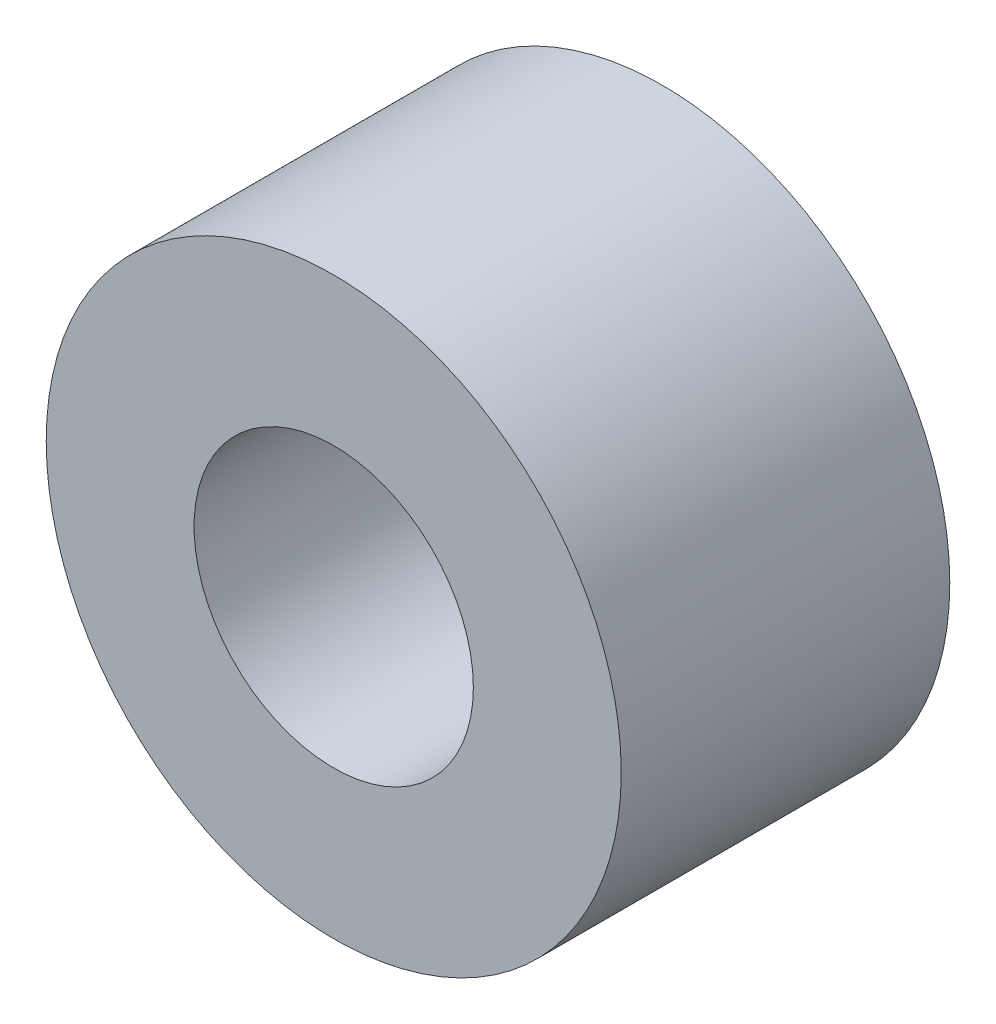
ISO-10303-21;
HEADER;
FILE_DESCRIPTION(('STEP AP214'),'2;1');
FILE_NAME('part.step','',(''),(''),'','','');
FILE_SCHEMA(('AUTOMOTIVE_DESIGN { 1 0 10303 214 1 1 1 1 }'));
ENDSEC;
DATA;
#1=APPLICATION_CONTEXT('core data for automotive mechanical design processes');
#2=APPLICATION_PROTOCOL_DEFINITION('international standard','automotive_design',2000,#1);
#3=PRODUCT_CONTEXT('',#1,'mechanical');
#4=PRODUCT('Part','Part','',(#3));
#5=PRODUCT_RELATED_PRODUCT_CATEGORY('part','',(#4));
#6=PRODUCT_DEFINITION_FORMATION('','',#4);
#7=PRODUCT_DEFINITION_CONTEXT('part definition',#1,'design');
#8=PRODUCT_DEFINITION('design','',#6,#7);
#9=PRODUCT_DEFINITION_SHAPE('','',#8);
#10=(LENGTH_UNIT() NAMED_UNIT(*) SI_UNIT(.MILLI.,.METRE.));
#11=(NAMED_UNIT(*) PLANE_ANGLE_UNIT() SI_UNIT($,.RADIAN.));
#12=(NAMED_UNIT(*) SI_UNIT($,.STERADIAN.) SOLID_ANGLE_UNIT());
#13=UNCERTAINTY_MEASURE_WITH_UNIT(LENGTH_MEASURE(1.E-05),#10,'distance_accuracy_value','');
#14=(GEOMETRIC_REPRESENTATION_CONTEXT(3) GLOBAL_UNCERTAINTY_ASSIGNED_CONTEXT((#13)) GLOBAL_UNIT_ASSIGNED_CONTEXT((#10,
#11,#12)) REPRESENTATION_CONTEXT('',''));
#15=CARTESIAN_POINT('',(0.,0.,0.));
#16=DIRECTION('',(0.,0.,1.));
#17=DIRECTION('',(1.,0.,0.));
#18=AXIS2_PLACEMENT_3D('',#15,#16,#17);
#19=CARTESIAN_POINT('',(0.,0.,4.));
#20=DIRECTION('',(0.,0.,1.));
#21=DIRECTION('',(1.,0.,0.));
#22=AXIS2_PLACEMENT_3D('',#19,#20,#21);
#23=PLANE('',#22);
#24=CARTESIAN_POINT('',(0.,0.,4.));
#25=DIRECTION('',(0.,0.,1.));
#26=DIRECTION('',(1.,0.,0.));
#27=AXIS2_PLACEMENT_3D('',#24,#25,#26);
#28=CIRCLE('',#27,3.5);
#29=CARTESIAN_POINT('',(3.5,0.,4.));
#30=VERTEX_POINT('',#29);
#31=EDGE_CURVE('E10',#30,#30,#28,.T.);
#32=ORIENTED_EDGE('',*,*,#31,.T.);
#33=EDGE_LOOP('',(#32));
#34=FACE_BOUND('',#33,.T.);
#35=CARTESIAN_POINT('',(0.,0.,4.));
#36=DIRECTION('',(0.,0.,1.));
#37=DIRECTION('',(1.,0.,0.));
#38=AXIS2_PLACEMENT_3D('',#35,#36,#37);
#39=CIRCLE('',#38,1.7);
#40=CARTESIAN_POINT('',(1.7,0.,4.));
#41=VERTEX_POINT('',#40);
#42=EDGE_CURVE('E46',#41,#41,#39,.T.);
#43=ORIENTED_EDGE('',*,*,#42,.F.);
#44=EDGE_LOOP('',(#43));
#45=FACE_BOUND('',#44,.T.);
#46=ADVANCED_FACE('F35',(#34,#45),#23,.T.);
#47=CARTESIAN_POINT('',(0.,0.,0.));
#48=DIRECTION('',(0.,0.,1.));
#49=DIRECTION('',(1.,0.,0.));
#50=AXIS2_PLACEMENT_3D('',#47,#48,#49);
#51=PLANE('',#50);
#52=CARTESIAN_POINT('',(0.,0.,0.));
#53=DIRECTION('',(0.,0.,1.));
#54=DIRECTION('',(1.,0.,0.));
#55=AXIS2_PLACEMENT_3D('',#52,#53,#54);
#56=CIRCLE('',#55,3.5);
#57=CARTESIAN_POINT('',(3.5,0.,0.));
#58=VERTEX_POINT('',#57);
#59=EDGE_CURVE('E39',#58,#58,#56,.T.);
#60=ORIENTED_EDGE('',*,*,#59,.F.);
#61=EDGE_LOOP('',(#60));
#62=FACE_BOUND('',#61,.T.);
#63=CARTESIAN_POINT('',(0.,0.,0.));
#64=DIRECTION('',(0.,0.,1.));
#65=DIRECTION('',(1.,0.,0.));
#66=AXIS2_PLACEMENT_3D('',#63,#64,#65);
#67=CIRCLE('',#66,1.7);
#68=CARTESIAN_POINT('',(1.7,0.,0.));
#69=VERTEX_POINT('',#68);
#70=EDGE_CURVE('E48',#69,#69,#67,.T.);
#71=ORIENTED_EDGE('',*,*,#70,.T.);
#72=EDGE_LOOP('',(#71));
#73=FACE_BOUND('',#72,.T.);
#74=ADVANCED_FACE('F58',(#62,#73),#51,.F.);
#75=CARTESIAN_POINT('',(0.,0.,4.));
#76=DIRECTION('',(0.,0.,-1.));
#77=DIRECTION('',(-1.,0.,0.));
#78=AXIS2_PLACEMENT_3D('',#75,#76,#77);
#79=CYLINDRICAL_SURFACE('',#78,3.5);
#80=ORIENTED_EDGE('',*,*,#31,.F.);
#81=EDGE_LOOP('',(#80));
#82=FACE_BOUND('',#81,.T.);
#83=ORIENTED_EDGE('',*,*,#59,.T.);
#84=EDGE_LOOP('',(#83));
#85=FACE_BOUND('',#84,.T.);
#86=ADVANCED_FACE('F37',(#82,#85),#79,.T.);
#87=CARTESIAN_POINT('',(0.,0.,4.));
#88=DIRECTION('',(0.,0.,-1.));
#89=DIRECTION('',(-1.,0.,0.));
#90=AXIS2_PLACEMENT_3D('',#87,#88,#89);
#91=CYLINDRICAL_SURFACE('',#90,1.7);
#92=ORIENTED_EDGE('',*,*,#42,.T.);
#93=EDGE_LOOP('',(#92));
#94=FACE_BOUND('',#93,.T.);
#95=ORIENTED_EDGE('',*,*,#70,.F.);
#96=EDGE_LOOP('',(#95));
#97=FACE_BOUND('',#96,.T.);
#98=ADVANCED_FACE('F54',(#94,#97),#91,.F.);
#99=CLOSED_SHELL('',(#46,#74,#86,#98));
#100=MANIFOLD_SOLID_BREP('B2',#99);
#101=ADVANCED_BREP_SHAPE_REPRESENTATION('',(#18,#100),#14);
#102=SHAPE_DEFINITION_REPRESENTATION(#9,#101);
ENDSEC;
END-ISO-10303-21;
